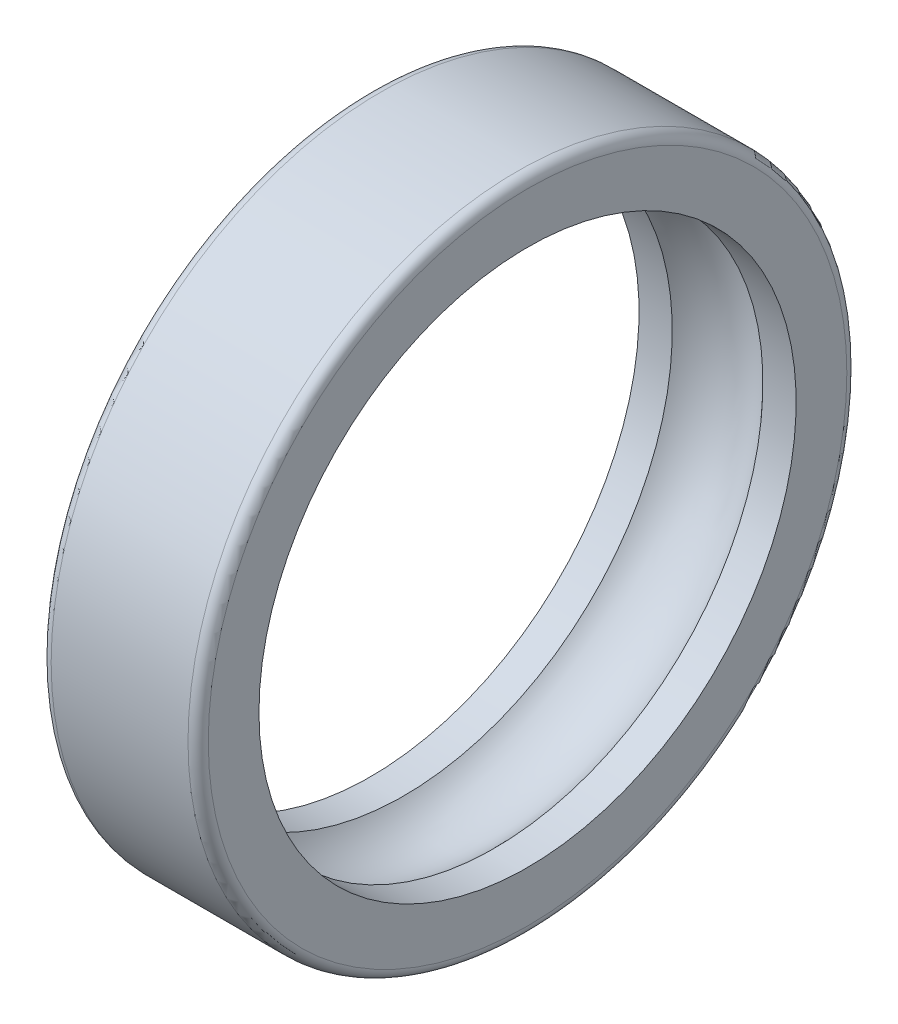
ISO-10303-21;
HEADER;
FILE_DESCRIPTION(('STEP AP214'),'2;1');
FILE_NAME('part.step','',(''),(''),'','','');
FILE_SCHEMA(('AUTOMOTIVE_DESIGN { 1 0 10303 214 1 1 1 1 }'));
ENDSEC;
DATA;
#1=APPLICATION_CONTEXT('core data for automotive mechanical design processes');
#2=APPLICATION_PROTOCOL_DEFINITION('international standard','automotive_design',2000,#1);
#3=PRODUCT_CONTEXT('',#1,'mechanical');
#4=PRODUCT('Part','Part','',(#3));
#5=PRODUCT_RELATED_PRODUCT_CATEGORY('part','',(#4));
#6=PRODUCT_DEFINITION_FORMATION('','',#4);
#7=PRODUCT_DEFINITION_CONTEXT('part definition',#1,'design');
#8=PRODUCT_DEFINITION('design','',#6,#7);
#9=PRODUCT_DEFINITION_SHAPE('','',#8);
#10=(LENGTH_UNIT() NAMED_UNIT(*) SI_UNIT(.MILLI.,.METRE.));
#11=(NAMED_UNIT(*) PLANE_ANGLE_UNIT() SI_UNIT($,.RADIAN.));
#12=(NAMED_UNIT(*) SI_UNIT($,.STERADIAN.) SOLID_ANGLE_UNIT());
#13=UNCERTAINTY_MEASURE_WITH_UNIT(LENGTH_MEASURE(1.E-05),#10,'distance_accuracy_value','');
#14=(GEOMETRIC_REPRESENTATION_CONTEXT(3) GLOBAL_UNCERTAINTY_ASSIGNED_CONTEXT((#13)) GLOBAL_UNIT_ASSIGNED_CONTEXT((#10,
#11,#12)) REPRESENTATION_CONTEXT('',''));
#15=CARTESIAN_POINT('',(0.,0.,0.));
#16=DIRECTION('',(0.,0.,1.));
#17=DIRECTION('',(1.,0.,0.));
#18=AXIS2_PLACEMENT_3D('',#15,#16,#17);
#19=CARTESIAN_POINT('',(0.,0.,0.));
#20=DIRECTION('',(-1.,0.,0.));
#21=DIRECTION('',(0.,0.,1.));
#22=AXIS2_PLACEMENT_3D('',#19,#20,#21);
#23=CYLINDRICAL_SURFACE('',#22,53.);
#24=CARTESIAN_POINT('',(15.5,0.,0.));
#25=DIRECTION('',(-1.,0.,0.));
#26=DIRECTION('',(0.,0.,1.));
#27=AXIS2_PLACEMENT_3D('',#24,#25,#26);
#28=CIRCLE('',#27,53.);
#29=CARTESIAN_POINT('',(15.5,0.,53.));
#30=VERTEX_POINT('',#29);
#31=EDGE_CURVE('E63',#30,#30,#28,.T.);
#32=ORIENTED_EDGE('',*,*,#31,.F.);
#33=EDGE_LOOP('',(#32));
#34=FACE_BOUND('',#33,.T.);
#35=CARTESIAN_POINT('',(8.94427190999915,0.,0.));
#36=DIRECTION('',(-1.,0.,0.));
#37=DIRECTION('',(0.,0.,1.));
#38=AXIS2_PLACEMENT_3D('',#35,#36,#37);
#39=CIRCLE('',#38,53.);
#40=CARTESIAN_POINT('',(8.94427190999915,0.,53.));
#41=VERTEX_POINT('',#40);
#42=EDGE_CURVE('E54',#41,#41,#39,.T.);
#43=ORIENTED_EDGE('',*,*,#42,.T.);
#44=EDGE_LOOP('',(#43));
#45=FACE_BOUND('',#44,.T.);
#46=ADVANCED_FACE('F34',(#34,#45),#23,.F.);
#47=CARTESIAN_POINT('',(0.,0.,0.));
#48=DIRECTION('',(-1.,0.,0.));
#49=DIRECTION('',(0.,0.,1.));
#50=AXIS2_PLACEMENT_3D('',#47,#48,#49);
#51=TOROIDAL_SURFACE('',#50,45.,12.);
#52=ORIENTED_EDGE('',*,*,#42,.F.);
#53=EDGE_LOOP('',(#52));
#54=FACE_BOUND('',#53,.T.);
#55=CARTESIAN_POINT('',(-8.94427190999915,0.,0.));
#56=DIRECTION('',(-1.,0.,0.));
#57=DIRECTION('',(0.,0.,1.));
#58=AXIS2_PLACEMENT_3D('',#55,#56,#57);
#59=CIRCLE('',#58,53.);
#60=CARTESIAN_POINT('',(-8.94427190999915,0.,53.));
#61=VERTEX_POINT('',#60);
#62=EDGE_CURVE('E57',#61,#61,#59,.T.);
#63=ORIENTED_EDGE('',*,*,#62,.T.);
#64=EDGE_LOOP('',(#63));
#65=FACE_BOUND('',#64,.T.);
#66=ADVANCED_FACE('F71',(#54,#65),#51,.F.);
#67=CARTESIAN_POINT('',(0.,0.,0.));
#68=DIRECTION('',(-1.,0.,0.));
#69=DIRECTION('',(0.,0.,1.));
#70=AXIS2_PLACEMENT_3D('',#67,#68,#69);
#71=CYLINDRICAL_SURFACE('',#70,53.);
#72=ORIENTED_EDGE('',*,*,#62,.F.);
#73=EDGE_LOOP('',(#72));
#74=FACE_BOUND('',#73,.T.);
#75=CARTESIAN_POINT('',(-15.5,0.,0.));
#76=DIRECTION('',(-1.,0.,0.));
#77=DIRECTION('',(0.,0.,1.));
#78=AXIS2_PLACEMENT_3D('',#75,#76,#77);
#79=CIRCLE('',#78,53.);
#80=CARTESIAN_POINT('',(-15.5,0.,53.));
#81=VERTEX_POINT('',#80);
#82=EDGE_CURVE('E60',#81,#81,#79,.T.);
#83=ORIENTED_EDGE('',*,*,#82,.T.);
#84=EDGE_LOOP('',(#83));
#85=FACE_BOUND('',#84,.T.);
#86=ADVANCED_FACE('F77',(#74,#85),#71,.F.);
#87=CARTESIAN_POINT('',(-15.5,65.,0.));
#88=DIRECTION('',(1.,0.,0.));
#89=DIRECTION('',(0.,0.,-1.));
#90=AXIS2_PLACEMENT_3D('',#87,#88,#89);
#91=PLANE('',#90);
#92=CARTESIAN_POINT('',(-15.5,0.,0.));
#93=DIRECTION('',(1.,0.,0.));
#94=DIRECTION('',(0.,0.,-1.));
#95=AXIS2_PLACEMENT_3D('',#92,#93,#94);
#96=CIRCLE('',#95,63.);
#97=CARTESIAN_POINT('',(-15.5,0.,-63.));
#98=VERTEX_POINT('',#97);
#99=EDGE_CURVE('E10',#98,#98,#96,.F.);
#100=ORIENTED_EDGE('',*,*,#99,.T.);
#101=EDGE_LOOP('',(#100));
#102=FACE_BOUND('',#101,.T.);
#103=ORIENTED_EDGE('',*,*,#82,.F.);
#104=EDGE_LOOP('',(#103));
#105=FACE_BOUND('',#104,.T.);
#106=ADVANCED_FACE('F83',(#102,#105),#91,.F.);
#107=CARTESIAN_POINT('',(0.,0.,0.));
#108=DIRECTION('',(-1.,0.,0.));
#109=DIRECTION('',(0.,0.,1.));
#110=AXIS2_PLACEMENT_3D('',#107,#108,#109);
#111=CYLINDRICAL_SURFACE('',#110,65.);
#112=CARTESIAN_POINT('',(13.5,0.,0.));
#113=DIRECTION('',(-1.,0.,0.));
#114=DIRECTION('',(0.,0.,1.));
#115=AXIS2_PLACEMENT_3D('',#112,#113,#114);
#116=CIRCLE('',#115,65.);
#117=CARTESIAN_POINT('',(13.5,0.,65.));
#118=VERTEX_POINT('',#117);
#119=EDGE_CURVE('E45',#118,#118,#116,.T.);
#120=ORIENTED_EDGE('',*,*,#119,.T.);
#121=EDGE_LOOP('',(#120));
#122=FACE_BOUND('',#121,.T.);
#123=CARTESIAN_POINT('',(-13.5,0.,0.));
#124=DIRECTION('',(1.,0.,0.));
#125=DIRECTION('',(0.,0.,-1.));
#126=AXIS2_PLACEMENT_3D('',#123,#124,#125);
#127=CIRCLE('',#126,65.);
#128=CARTESIAN_POINT('',(-13.5,0.,-65.));
#129=VERTEX_POINT('',#128);
#130=EDGE_CURVE('E49',#129,#129,#127,.T.);
#131=ORIENTED_EDGE('',*,*,#130,.T.);
#132=EDGE_LOOP('',(#131));
#133=FACE_BOUND('',#132,.T.);
#134=ADVANCED_FACE('F88',(#122,#133),#111,.T.);
#135=CARTESIAN_POINT('',(15.5,65.,0.));
#136=DIRECTION('',(-1.,0.,0.));
#137=DIRECTION('',(0.,0.,1.));
#138=AXIS2_PLACEMENT_3D('',#135,#136,#137);
#139=PLANE('',#138);
#140=CARTESIAN_POINT('',(15.5,0.,0.));
#141=DIRECTION('',(-1.,0.,0.));
#142=DIRECTION('',(0.,0.,1.));
#143=AXIS2_PLACEMENT_3D('',#140,#141,#142);
#144=CIRCLE('',#143,63.);
#145=CARTESIAN_POINT('',(15.5,0.,63.));
#146=VERTEX_POINT('',#145);
#147=EDGE_CURVE('E41',#146,#146,#144,.F.);
#148=ORIENTED_EDGE('',*,*,#147,.T.);
#149=EDGE_LOOP('',(#148));
#150=FACE_BOUND('',#149,.T.);
#151=ORIENTED_EDGE('',*,*,#31,.T.);
#152=EDGE_LOOP('',(#151));
#153=FACE_BOUND('',#152,.T.);
#154=ADVANCED_FACE('F67',(#150,#153),#139,.F.);
#155=CARTESIAN_POINT('',(13.5,0.,0.));
#156=DIRECTION('',(-1.,0.,0.));
#157=DIRECTION('',(0.,0.,1.));
#158=AXIS2_PLACEMENT_3D('',#155,#156,#157);
#159=TOROIDAL_SURFACE('',#158,63.,2.);
#160=ORIENTED_EDGE('',*,*,#147,.F.);
#161=EDGE_LOOP('',(#160));
#162=FACE_BOUND('',#161,.T.);
#163=ORIENTED_EDGE('',*,*,#119,.F.);
#164=EDGE_LOOP('',(#163));
#165=FACE_BOUND('',#164,.T.);
#166=ADVANCED_FACE('F96',(#162,#165),#159,.T.);
#167=CARTESIAN_POINT('',(-13.5,0.,0.));
#168=DIRECTION('',(1.,0.,0.));
#169=DIRECTION('',(0.,0.,-1.));
#170=AXIS2_PLACEMENT_3D('',#167,#168,#169);
#171=TOROIDAL_SURFACE('',#170,63.,2.);
#172=ORIENTED_EDGE('',*,*,#130,.F.);
#173=EDGE_LOOP('',(#172));
#174=FACE_BOUND('',#173,.T.);
#175=ORIENTED_EDGE('',*,*,#99,.F.);
#176=EDGE_LOOP('',(#175));
#177=FACE_BOUND('',#176,.T.);
#178=ADVANCED_FACE('F36',(#174,#177),#171,.T.);
#179=CLOSED_SHELL('',(#46,#66,#86,#106,#134,#154,#166,#178));
#180=MANIFOLD_SOLID_BREP('B2',#179);
#181=ADVANCED_BREP_SHAPE_REPRESENTATION('',(#18,#180),#14);
#182=SHAPE_DEFINITION_REPRESENTATION(#9,#181);
ENDSEC;
END-ISO-10303-21;
